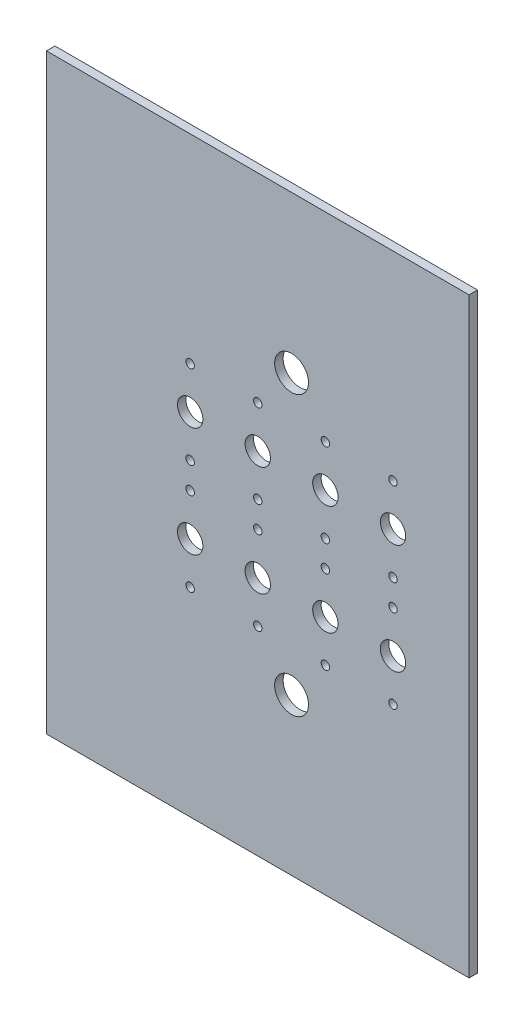
ISO-10303-21;
HEADER;
FILE_DESCRIPTION(('STEP AP214'),'2;1');
FILE_NAME('part.step','',(''),(''),'','','');
FILE_SCHEMA(('AUTOMOTIVE_DESIGN { 1 0 10303 214 1 1 1 1 }'));
ENDSEC;
DATA;
#1=APPLICATION_CONTEXT('core data for automotive mechanical design processes');
#2=APPLICATION_PROTOCOL_DEFINITION('international standard','automotive_design',2000,#1);
#3=PRODUCT_CONTEXT('',#1,'mechanical');
#4=PRODUCT('Part','Part','',(#3));
#5=PRODUCT_RELATED_PRODUCT_CATEGORY('part','',(#4));
#6=PRODUCT_DEFINITION_FORMATION('','',#4);
#7=PRODUCT_DEFINITION_CONTEXT('part definition',#1,'design');
#8=PRODUCT_DEFINITION('design','',#6,#7);
#9=PRODUCT_DEFINITION_SHAPE('','',#8);
#10=(LENGTH_UNIT() NAMED_UNIT(*) SI_UNIT(.MILLI.,.METRE.));
#11=(NAMED_UNIT(*) PLANE_ANGLE_UNIT() SI_UNIT($,.RADIAN.));
#12=(NAMED_UNIT(*) SI_UNIT($,.STERADIAN.) SOLID_ANGLE_UNIT());
#13=UNCERTAINTY_MEASURE_WITH_UNIT(LENGTH_MEASURE(1.E-05),#10,'distance_accuracy_value','');
#14=(GEOMETRIC_REPRESENTATION_CONTEXT(3) GLOBAL_UNCERTAINTY_ASSIGNED_CONTEXT((#13)) GLOBAL_UNIT_ASSIGNED_CONTEXT((#10,
#11,#12)) REPRESENTATION_CONTEXT('',''));
#15=CARTESIAN_POINT('',(0.,0.,0.));
#16=DIRECTION('',(0.,0.,1.));
#17=DIRECTION('',(1.,0.,0.));
#18=AXIS2_PLACEMENT_3D('',#15,#16,#17);
#19=CARTESIAN_POINT('',(0.,0.,10.));
#20=DIRECTION('',(0.,0.,-1.00000000000002));
#21=DIRECTION('',(-1.,0.,0.));
#22=AXIS2_PLACEMENT_3D('',#19,#20,#21);
#23=PLANE('',#22);
#24=CARTESIAN_POINT('',(330.,-65.000000000001,9.99999999999796));
#25=DIRECTION('',(0.,0.,1.00000000000002));
#26=DIRECTION('',(1.,0.,0.));
#27=AXIS2_PLACEMENT_3D('',#24,#25,#26);
#28=CIRCLE('',#27,14.9999999999997);
#29=CARTESIAN_POINT('',(345.,-65.000000000001,9.99999999999791));
#30=VERTEX_POINT('',#29);
#31=EDGE_CURVE('E260',#30,#30,#28,.T.);
#32=ORIENTED_EDGE('',*,*,#31,.F.);
#33=EDGE_LOOP('',(#32));
#34=FACE_BOUND('',#33,.T.);
#35=CARTESIAN_POINT('',(169.999999999999,-65.000000000001,9.99999999999796));
#36=DIRECTION('',(0.,0.,1.00000000000002));
#37=DIRECTION('',(1.,0.,0.));
#38=AXIS2_PLACEMENT_3D('',#35,#36,#37);
#39=CIRCLE('',#38,15.0000000000001);
#40=CARTESIAN_POINT('',(185.,-65.000000000001,9.99999999999791));
#41=VERTEX_POINT('',#40);
#42=EDGE_CURVE('E243',#41,#41,#39,.T.);
#43=ORIENTED_EDGE('',*,*,#42,.F.);
#44=EDGE_LOOP('',(#43));
#45=FACE_BOUND('',#44,.T.);
#46=CARTESIAN_POINT('',(410.,-114.500000000002,9.99999999999796));
#47=DIRECTION('',(0.,0.,1.00000000000002));
#48=DIRECTION('',(1.,0.,0.));
#49=AXIS2_PLACEMENT_3D('',#46,#47,#48);
#50=CIRCLE('',#49,4.99999999999901);
#51=CARTESIAN_POINT('',(414.999999999999,-114.500000000002,9.99999999999794));
#52=VERTEX_POINT('',#51);
#53=EDGE_CURVE('E231',#52,#52,#50,.T.);
#54=ORIENTED_EDGE('',*,*,#53,.F.);
#55=EDGE_LOOP('',(#54));
#56=FACE_BOUND('',#55,.T.);
#57=CARTESIAN_POINT('',(330.,-114.500000000002,9.99999999999796));
#58=DIRECTION('',(0.,0.,1.00000000000002));
#59=DIRECTION('',(1.,0.,0.));
#60=AXIS2_PLACEMENT_3D('',#57,#58,#59);
#61=CIRCLE('',#60,4.99999999999901);
#62=CARTESIAN_POINT('',(334.999999999999,-114.500000000002,9.99999999999794));
#63=VERTEX_POINT('',#62);
#64=EDGE_CURVE('E222',#63,#63,#61,.T.);
#65=ORIENTED_EDGE('',*,*,#64,.F.);
#66=EDGE_LOOP('',(#65));
#67=FACE_BOUND('',#66,.T.);
#68=CARTESIAN_POINT('',(250.,-114.500000000002,9.99999999999796));
#69=DIRECTION('',(0.,0.,1.00000000000002));
#70=DIRECTION('',(1.,0.,0.));
#71=AXIS2_PLACEMENT_3D('',#68,#69,#70);
#72=CIRCLE('',#71,4.99999999999989);
#73=CARTESIAN_POINT('',(254.999999999999,-114.500000000002,9.99999999999794));
#74=VERTEX_POINT('',#73);
#75=EDGE_CURVE('E207',#74,#74,#72,.T.);
#76=ORIENTED_EDGE('',*,*,#75,.F.);
#77=EDGE_LOOP('',(#76));
#78=FACE_BOUND('',#77,.T.);
#79=CARTESIAN_POINT('',(169.999999999999,-114.500000000002,9.99999999999796));
#80=DIRECTION('',(0.,0.,1.00000000000002));
#81=DIRECTION('',(1.,0.,0.));
#82=AXIS2_PLACEMENT_3D('',#79,#80,#81);
#83=CIRCLE('',#82,4.99999999999989);
#84=CARTESIAN_POINT('',(174.999999999999,-114.500000000002,9.99999999999794));
#85=VERTEX_POINT('',#84);
#86=EDGE_CURVE('E197',#85,#85,#83,.T.);
#87=ORIENTED_EDGE('',*,*,#86,.F.);
#88=EDGE_LOOP('',(#87));
#89=FACE_BOUND('',#88,.T.);
#90=CARTESIAN_POINT('',(330.,65.0000000000014,9.99999999999796));
#91=DIRECTION('',(0.,0.,1.00000000000002));
#92=DIRECTION('',(1.,0.,0.));
#93=AXIS2_PLACEMENT_3D('',#90,#91,#92);
#94=CIRCLE('',#93,14.9999999999997);
#95=CARTESIAN_POINT('',(345.,65.0000000000014,9.99999999999791));
#96=VERTEX_POINT('',#95);
#97=EDGE_CURVE('E183',#96,#96,#94,.T.);
#98=ORIENTED_EDGE('',*,*,#97,.F.);
#99=EDGE_LOOP('',(#98));
#100=FACE_BOUND('',#99,.T.);
#101=CARTESIAN_POINT('',(169.999999999999,65.0000000000014,9.99999999999796));
#102=DIRECTION('',(0.,0.,1.00000000000002));
#103=DIRECTION('',(1.,0.,0.));
#104=AXIS2_PLACEMENT_3D('',#101,#102,#103);
#105=CIRCLE('',#104,15.0000000000001);
#106=CARTESIAN_POINT('',(185.,65.0000000000014,9.99999999999791));
#107=VERTEX_POINT('',#106);
#108=EDGE_CURVE('E174',#107,#107,#105,.T.);
#109=ORIENTED_EDGE('',*,*,#108,.F.);
#110=EDGE_LOOP('',(#109));
#111=FACE_BOUND('',#110,.T.);
#112=CARTESIAN_POINT('',(290.,165.000000000002,9.99999999999796));
#113=DIRECTION('',(0.,0.,1.00000000000002));
#114=DIRECTION('',(1.,0.,0.));
#115=AXIS2_PLACEMENT_3D('',#112,#113,#114);
#116=CIRCLE('',#115,20.);
#117=CARTESIAN_POINT('',(310.,165.000000000002,9.99999999999789));
#118=VERTEX_POINT('',#117);
#119=EDGE_CURVE('E161',#118,#118,#116,.T.);
#120=ORIENTED_EDGE('',*,*,#119,.F.);
#121=EDGE_LOOP('',(#120));
#122=FACE_BOUND('',#121,.T.);
#123=CARTESIAN_POINT('',(410.,114.500000000003,9.99999999999796));
#124=DIRECTION('',(0.,0.,1.00000000000002));
#125=DIRECTION('',(1.,0.,0.));
#126=AXIS2_PLACEMENT_3D('',#123,#124,#125);
#127=CIRCLE('',#126,4.99999999999901);
#128=CARTESIAN_POINT('',(414.999999999999,114.500000000003,9.99999999999794));
#129=VERTEX_POINT('',#128);
#130=EDGE_CURVE('E149',#129,#129,#127,.T.);
#131=ORIENTED_EDGE('',*,*,#130,.F.);
#132=EDGE_LOOP('',(#131));
#133=FACE_BOUND('',#132,.T.);
#134=CARTESIAN_POINT('',(330.,114.500000000003,9.99999999999796));
#135=DIRECTION('',(0.,0.,1.00000000000002));
#136=DIRECTION('',(1.,0.,0.));
#137=AXIS2_PLACEMENT_3D('',#134,#135,#136);
#138=CIRCLE('',#137,4.99999999999901);
#139=CARTESIAN_POINT('',(334.999999999999,114.500000000003,9.99999999999794));
#140=VERTEX_POINT('',#139);
#141=EDGE_CURVE('E140',#140,#140,#138,.T.);
#142=ORIENTED_EDGE('',*,*,#141,.F.);
#143=EDGE_LOOP('',(#142));
#144=FACE_BOUND('',#143,.T.);
#145=CARTESIAN_POINT('',(250.,114.500000000003,9.99999999999796));
#146=DIRECTION('',(0.,0.,1.00000000000002));
#147=DIRECTION('',(1.,0.,0.));
#148=AXIS2_PLACEMENT_3D('',#145,#146,#147);
#149=CIRCLE('',#148,4.99999999999989);
#150=CARTESIAN_POINT('',(254.999999999999,114.500000000003,9.99999999999794));
#151=VERTEX_POINT('',#150);
#152=EDGE_CURVE('E124',#151,#151,#149,.T.);
#153=ORIENTED_EDGE('',*,*,#152,.F.);
#154=EDGE_LOOP('',(#153));
#155=FACE_BOUND('',#154,.T.);
#156=CARTESIAN_POINT('',(169.999999999999,114.500000000003,9.99999999999796));
#157=DIRECTION('',(0.,0.,1.00000000000002));
#158=DIRECTION('',(1.,0.,0.));
#159=AXIS2_PLACEMENT_3D('',#156,#157,#158);
#160=CIRCLE('',#159,4.99999999999989);
#161=CARTESIAN_POINT('',(174.999999999999,114.500000000003,9.99999999999794));
#162=VERTEX_POINT('',#161);
#163=EDGE_CURVE('E102',#162,#162,#160,.T.);
#164=ORIENTED_EDGE('',*,*,#163,.F.);
#165=EDGE_LOOP('',(#164));
#166=FACE_BOUND('',#165,.T.);
#167=DIRECTION('',(0.,-1.00000000000002,0.));
#168=VECTOR('',#167,1.);
#169=CARTESIAN_POINT('',(0.,-350.000000000004,10.));
#170=LINE('',#169,#168);
#171=CARTESIAN_POINT('',(0.,350.000000000004,10.));
#172=VERTEX_POINT('',#171);
#173=CARTESIAN_POINT('',(0.,-350.000000000004,10.));
#174=VERTEX_POINT('',#173);
#175=EDGE_CURVE('E90',#172,#174,#170,.T.);
#176=ORIENTED_EDGE('',*,*,#175,.T.);
#177=DIRECTION('',(1.,0.,0.));
#178=VECTOR('',#177,1.);
#179=CARTESIAN_POINT('',(500.,-350.000000000004,9.9999999999979));
#180=LINE('',#179,#178);
#181=CARTESIAN_POINT('',(500.,-350.000000000004,9.9999999999979));
#182=VERTEX_POINT('',#181);
#183=EDGE_CURVE('E82',#174,#182,#180,.T.);
#184=ORIENTED_EDGE('',*,*,#183,.T.);
#185=DIRECTION('',(0.,1.00000000000002,0.));
#186=VECTOR('',#185,1.);
#187=CARTESIAN_POINT('',(500.,350.000000000004,9.9999999999979));
#188=LINE('',#187,#186);
#189=CARTESIAN_POINT('',(500.,350.000000000004,9.9999999999979));
#190=VERTEX_POINT('',#189);
#191=EDGE_CURVE('E87',#182,#190,#188,.T.);
#192=ORIENTED_EDGE('',*,*,#191,.T.);
#193=DIRECTION('',(-1.,0.,0.));
#194=VECTOR('',#193,1.);
#195=CARTESIAN_POINT('',(0.,350.000000000004,10.));
#196=LINE('',#195,#194);
#197=EDGE_CURVE('E53',#190,#172,#196,.T.);
#198=ORIENTED_EDGE('',*,*,#197,.T.);
#199=EDGE_LOOP('',(#176,#184,#192,#198));
#200=FACE_BOUND('',#199,.T.);
#201=CARTESIAN_POINT('',(169.999999999999,15.5000000000001,9.99999999999796));
#202=DIRECTION('',(0.,0.,1.00000000000002));
#203=DIRECTION('',(1.,0.,0.));
#204=AXIS2_PLACEMENT_3D('',#201,#202,#203);
#205=CIRCLE('',#204,4.99999999999989);
#206=CARTESIAN_POINT('',(174.999999999999,15.5000000000001,9.99999999999794));
#207=VERTEX_POINT('',#206);
#208=EDGE_CURVE('E116',#207,#207,#205,.T.);
#209=ORIENTED_EDGE('',*,*,#208,.F.);
#210=EDGE_LOOP('',(#209));
#211=FACE_BOUND('',#210,.T.);
#212=CARTESIAN_POINT('',(250.,15.5000000000001,9.99999999999796));
#213=DIRECTION('',(0.,0.,1.00000000000002));
#214=DIRECTION('',(1.,0.,0.));
#215=AXIS2_PLACEMENT_3D('',#212,#213,#214);
#216=CIRCLE('',#215,4.99999999999989);
#217=CARTESIAN_POINT('',(254.999999999999,15.5000000000001,9.99999999999794));
#218=VERTEX_POINT('',#217);
#219=EDGE_CURVE('E132',#218,#218,#216,.T.);
#220=ORIENTED_EDGE('',*,*,#219,.F.);
#221=EDGE_LOOP('',(#220));
#222=FACE_BOUND('',#221,.T.);
#223=CARTESIAN_POINT('',(330.,15.5000000000001,9.99999999999796));
#224=DIRECTION('',(0.,0.,1.00000000000002));
#225=DIRECTION('',(1.,0.,0.));
#226=AXIS2_PLACEMENT_3D('',#223,#224,#225);
#227=CIRCLE('',#226,4.99999999999901);
#228=CARTESIAN_POINT('',(334.999999999999,15.5000000000001,9.99999999999794));
#229=VERTEX_POINT('',#228);
#230=EDGE_CURVE('E141',#229,#229,#227,.T.);
#231=ORIENTED_EDGE('',*,*,#230,.F.);
#232=EDGE_LOOP('',(#231));
#233=FACE_BOUND('',#232,.T.);
#234=CARTESIAN_POINT('',(410.,15.5000000000001,9.99999999999796));
#235=DIRECTION('',(0.,0.,1.00000000000002));
#236=DIRECTION('',(1.,0.,0.));
#237=AXIS2_PLACEMENT_3D('',#234,#235,#236);
#238=CIRCLE('',#237,4.99999999999901);
#239=CARTESIAN_POINT('',(414.999999999999,15.5000000000001,9.99999999999794));
#240=VERTEX_POINT('',#239);
#241=EDGE_CURVE('E154',#240,#240,#238,.T.);
#242=ORIENTED_EDGE('',*,*,#241,.F.);
#243=EDGE_LOOP('',(#242));
#244=FACE_BOUND('',#243,.T.);
#245=CARTESIAN_POINT('',(290.,-165.000000000002,9.99999999999796));
#246=DIRECTION('',(0.,0.,1.00000000000002));
#247=DIRECTION('',(1.,0.,0.));
#248=AXIS2_PLACEMENT_3D('',#245,#246,#247);
#249=CIRCLE('',#248,20.);
#250=CARTESIAN_POINT('',(310.,-165.000000000002,9.99999999999789));
#251=VERTEX_POINT('',#250);
#252=EDGE_CURVE('E170',#251,#251,#249,.T.);
#253=ORIENTED_EDGE('',*,*,#252,.F.);
#254=EDGE_LOOP('',(#253));
#255=FACE_BOUND('',#254,.T.);
#256=CARTESIAN_POINT('',(250.,65.0000000000014,9.99999999999796));
#257=DIRECTION('',(0.,0.,1.00000000000002));
#258=DIRECTION('',(1.,0.,0.));
#259=AXIS2_PLACEMENT_3D('',#256,#257,#258);
#260=CIRCLE('',#259,15.0000000000001);
#261=CARTESIAN_POINT('',(265.,65.0000000000014,9.99999999999791));
#262=VERTEX_POINT('',#261);
#263=EDGE_CURVE('E177',#262,#262,#260,.T.);
#264=ORIENTED_EDGE('',*,*,#263,.F.);
#265=EDGE_LOOP('',(#264));
#266=FACE_BOUND('',#265,.T.);
#267=CARTESIAN_POINT('',(410.,65.0000000000014,9.99999999999796));
#268=DIRECTION('',(0.,0.,1.00000000000002));
#269=DIRECTION('',(1.,0.,0.));
#270=AXIS2_PLACEMENT_3D('',#267,#268,#269);
#271=CIRCLE('',#270,14.9999999999997);
#272=CARTESIAN_POINT('',(425.,65.0000000000014,9.99999999999791));
#273=VERTEX_POINT('',#272);
#274=EDGE_CURVE('E193',#273,#273,#271,.T.);
#275=ORIENTED_EDGE('',*,*,#274,.F.);
#276=EDGE_LOOP('',(#275));
#277=FACE_BOUND('',#276,.T.);
#278=CARTESIAN_POINT('',(169.999999999999,-15.5000000000001,9.99999999999796));
#279=DIRECTION('',(0.,0.,1.00000000000002));
#280=DIRECTION('',(1.,0.,0.));
#281=AXIS2_PLACEMENT_3D('',#278,#279,#280);
#282=CIRCLE('',#281,4.99999999999989);
#283=CARTESIAN_POINT('',(174.999999999999,-15.5000000000001,9.99999999999794));
#284=VERTEX_POINT('',#283);
#285=EDGE_CURVE('E201',#284,#284,#282,.T.);
#286=ORIENTED_EDGE('',*,*,#285,.F.);
#287=EDGE_LOOP('',(#286));
#288=FACE_BOUND('',#287,.T.);
#289=CARTESIAN_POINT('',(250.,-15.5000000000001,9.99999999999796));
#290=DIRECTION('',(0.,0.,1.00000000000002));
#291=DIRECTION('',(1.,0.,0.));
#292=AXIS2_PLACEMENT_3D('',#289,#290,#291);
#293=CIRCLE('',#292,4.99999999999989);
#294=CARTESIAN_POINT('',(254.999999999999,-15.5000000000001,9.99999999999794));
#295=VERTEX_POINT('',#294);
#296=EDGE_CURVE('E214',#295,#295,#293,.T.);
#297=ORIENTED_EDGE('',*,*,#296,.F.);
#298=EDGE_LOOP('',(#297));
#299=FACE_BOUND('',#298,.T.);
#300=CARTESIAN_POINT('',(330.,-15.5000000000001,9.99999999999796));
#301=DIRECTION('',(0.,0.,1.00000000000002));
#302=DIRECTION('',(1.,0.,0.));
#303=AXIS2_PLACEMENT_3D('',#300,#301,#302);
#304=CIRCLE('',#303,4.99999999999901);
#305=CARTESIAN_POINT('',(334.999999999999,-15.5000000000001,9.99999999999794));
#306=VERTEX_POINT('',#305);
#307=EDGE_CURVE('E230',#306,#306,#304,.T.);
#308=ORIENTED_EDGE('',*,*,#307,.F.);
#309=EDGE_LOOP('',(#308));
#310=FACE_BOUND('',#309,.T.);
#311=CARTESIAN_POINT('',(410.,-15.5000000000001,9.99999999999796));
#312=DIRECTION('',(0.,0.,1.00000000000002));
#313=DIRECTION('',(1.,0.,0.));
#314=AXIS2_PLACEMENT_3D('',#311,#312,#313);
#315=CIRCLE('',#314,4.99999999999901);
#316=CARTESIAN_POINT('',(414.999999999999,-15.5000000000001,9.99999999999794));
#317=VERTEX_POINT('',#316);
#318=EDGE_CURVE('E239',#317,#317,#315,.T.);
#319=ORIENTED_EDGE('',*,*,#318,.F.);
#320=EDGE_LOOP('',(#319));
#321=FACE_BOUND('',#320,.T.);
#322=CARTESIAN_POINT('',(250.,-65.000000000001,9.99999999999796));
#323=DIRECTION('',(0.,0.,1.00000000000002));
#324=DIRECTION('',(1.,0.,0.));
#325=AXIS2_PLACEMENT_3D('',#322,#323,#324);
#326=CIRCLE('',#325,15.0000000000001);
#327=CARTESIAN_POINT('',(265.,-65.000000000001,9.99999999999791));
#328=VERTEX_POINT('',#327);
#329=EDGE_CURVE('E253',#328,#328,#326,.T.);
#330=ORIENTED_EDGE('',*,*,#329,.F.);
#331=EDGE_LOOP('',(#330));
#332=FACE_BOUND('',#331,.T.);
#333=CARTESIAN_POINT('',(410.,-65.000000000001,9.99999999999796));
#334=DIRECTION('',(0.,0.,1.00000000000002));
#335=DIRECTION('',(1.,0.,0.));
#336=AXIS2_PLACEMENT_3D('',#333,#334,#335);
#337=CIRCLE('',#336,14.9999999999997);
#338=CARTESIAN_POINT('',(425.,-65.000000000001,9.99999999999791));
#339=VERTEX_POINT('',#338);
#340=EDGE_CURVE('E263',#339,#339,#337,.T.);
#341=ORIENTED_EDGE('',*,*,#340,.F.);
#342=EDGE_LOOP('',(#341));
#343=FACE_BOUND('',#342,.T.);
#344=ADVANCED_FACE('F40',(#34,#45,#56,#67,#78,#89,#100,#111,#122,#133,#144,#155,#166,#200,#211,
#222,#233,#244,#255,#266,#277,#288,#299,#310,#321,#332,#343),#23,.F.);
#345=CARTESIAN_POINT('',(0.,0.,0.));
#346=DIRECTION('',(0.,0.,-1.00000000000002));
#347=DIRECTION('',(-1.,0.,0.));
#348=AXIS2_PLACEMENT_3D('',#345,#346,#347);
#349=PLANE('',#348);
#350=CARTESIAN_POINT('',(330.,-65.000000000001,-2.05391259555654E-12));
#351=DIRECTION('',(0.,0.,1.00000000000002));
#352=DIRECTION('',(1.,0.,0.));
#353=AXIS2_PLACEMENT_3D('',#350,#351,#352);
#354=CIRCLE('',#353,14.9999999999997);
#355=CARTESIAN_POINT('',(345.,-65.000000000001,-2.10225690468453E-12));
#356=VERTEX_POINT('',#355);
#357=EDGE_CURVE('E257',#356,#356,#354,.T.);
#358=ORIENTED_EDGE('',*,*,#357,.T.);
#359=EDGE_LOOP('',(#358));
#360=FACE_BOUND('',#359,.T.);
#361=CARTESIAN_POINT('',(169.999999999999,-65.000000000001,-2.05391259555654E-12));
#362=DIRECTION('',(0.,0.,1.00000000000002));
#363=DIRECTION('',(1.,0.,0.));
#364=AXIS2_PLACEMENT_3D('',#361,#362,#363);
#365=CIRCLE('',#364,15.0000000000001);
#366=CARTESIAN_POINT('',(185.,-65.000000000001,-2.10225690468453E-12));
#367=VERTEX_POINT('',#366);
#368=EDGE_CURVE('E246',#367,#367,#365,.T.);
#369=ORIENTED_EDGE('',*,*,#368,.T.);
#370=EDGE_LOOP('',(#369));
#371=FACE_BOUND('',#370,.T.);
#372=CARTESIAN_POINT('',(410.,-114.500000000002,-2.05391259555654E-12));
#373=DIRECTION('',(0.,0.,1.00000000000002));
#374=DIRECTION('',(1.,0.,0.));
#375=AXIS2_PLACEMENT_3D('',#372,#373,#374);
#376=CIRCLE('',#375,4.99999999999901);
#377=CARTESIAN_POINT('',(414.999999999999,-114.500000000002,-2.07002736526587E-12));
#378=VERTEX_POINT('',#377);
#379=EDGE_CURVE('E237',#378,#378,#376,.T.);
#380=ORIENTED_EDGE('',*,*,#379,.T.);
#381=EDGE_LOOP('',(#380));
#382=FACE_BOUND('',#381,.T.);
#383=CARTESIAN_POINT('',(330.,-114.500000000002,-2.05391259555654E-12));
#384=DIRECTION('',(0.,0.,1.00000000000002));
#385=DIRECTION('',(1.,0.,0.));
#386=AXIS2_PLACEMENT_3D('',#383,#384,#385);
#387=CIRCLE('',#386,4.99999999999901);
#388=CARTESIAN_POINT('',(334.999999999999,-114.500000000002,-2.07002736526587E-12));
#389=VERTEX_POINT('',#388);
#390=EDGE_CURVE('E221',#389,#389,#387,.T.);
#391=ORIENTED_EDGE('',*,*,#390,.T.);
#392=EDGE_LOOP('',(#391));
#393=FACE_BOUND('',#392,.T.);
#394=CARTESIAN_POINT('',(250.,-114.500000000002,-2.05391259555654E-12));
#395=DIRECTION('',(0.,0.,1.00000000000002));
#396=DIRECTION('',(1.,0.,0.));
#397=AXIS2_PLACEMENT_3D('',#394,#395,#396);
#398=CIRCLE('',#397,4.99999999999989);
#399=CARTESIAN_POINT('',(254.999999999999,-114.500000000002,-2.07002736526587E-12));
#400=VERTEX_POINT('',#399);
#401=EDGE_CURVE('E215',#400,#400,#398,.T.);
#402=ORIENTED_EDGE('',*,*,#401,.T.);
#403=EDGE_LOOP('',(#402));
#404=FACE_BOUND('',#403,.T.);
#405=CARTESIAN_POINT('',(169.999999999999,-114.500000000002,-2.05391259555654E-12));
#406=DIRECTION('',(0.,0.,1.00000000000002));
#407=DIRECTION('',(1.,0.,0.));
#408=AXIS2_PLACEMENT_3D('',#405,#406,#407);
#409=CIRCLE('',#408,4.99999999999989);
#410=CARTESIAN_POINT('',(174.999999999999,-114.500000000002,-2.07002736526587E-12));
#411=VERTEX_POINT('',#410);
#412=EDGE_CURVE('E199',#411,#411,#409,.T.);
#413=ORIENTED_EDGE('',*,*,#412,.T.);
#414=EDGE_LOOP('',(#413));
#415=FACE_BOUND('',#414,.T.);
#416=CARTESIAN_POINT('',(330.,65.0000000000014,-2.05391259555654E-12));
#417=DIRECTION('',(0.,0.,1.00000000000002));
#418=DIRECTION('',(1.,0.,0.));
#419=AXIS2_PLACEMENT_3D('',#416,#417,#418);
#420=CIRCLE('',#419,14.9999999999997);
#421=CARTESIAN_POINT('',(345.,65.0000000000014,-2.10225690468453E-12));
#422=VERTEX_POINT('',#421);
#423=EDGE_CURVE('E189',#422,#422,#420,.T.);
#424=ORIENTED_EDGE('',*,*,#423,.T.);
#425=EDGE_LOOP('',(#424));
#426=FACE_BOUND('',#425,.T.);
#427=CARTESIAN_POINT('',(169.999999999999,65.0000000000014,-2.05391259555654E-12));
#428=DIRECTION('',(0.,0.,1.00000000000002));
#429=DIRECTION('',(1.,0.,0.));
#430=AXIS2_PLACEMENT_3D('',#427,#428,#429);
#431=CIRCLE('',#430,15.0000000000001);
#432=CARTESIAN_POINT('',(185.,65.0000000000014,-2.10225690468453E-12));
#433=VERTEX_POINT('',#432);
#434=EDGE_CURVE('E178',#433,#433,#431,.T.);
#435=ORIENTED_EDGE('',*,*,#434,.T.);
#436=EDGE_LOOP('',(#435));
#437=FACE_BOUND('',#436,.T.);
#438=CARTESIAN_POINT('',(290.,165.000000000002,-2.05391259555654E-12));
#439=DIRECTION('',(0.,0.,1.00000000000002));
#440=DIRECTION('',(1.,0.,0.));
#441=AXIS2_PLACEMENT_3D('',#438,#439,#440);
#442=CIRCLE('',#441,20.);
#443=CARTESIAN_POINT('',(310.,165.000000000002,-2.11837167439386E-12));
#444=VERTEX_POINT('',#443);
#445=EDGE_CURVE('E163',#444,#444,#442,.T.);
#446=ORIENTED_EDGE('',*,*,#445,.T.);
#447=EDGE_LOOP('',(#446));
#448=FACE_BOUND('',#447,.T.);
#449=CARTESIAN_POINT('',(410.,114.500000000003,-2.05391259555654E-12));
#450=DIRECTION('',(0.,0.,1.00000000000002));
#451=DIRECTION('',(1.,0.,0.));
#452=AXIS2_PLACEMENT_3D('',#449,#450,#451);
#453=CIRCLE('',#452,4.99999999999901);
#454=CARTESIAN_POINT('',(414.999999999999,114.500000000003,-2.07002736526587E-12));
#455=VERTEX_POINT('',#454);
#456=EDGE_CURVE('E155',#455,#455,#453,.T.);
#457=ORIENTED_EDGE('',*,*,#456,.T.);
#458=EDGE_LOOP('',(#457));
#459=FACE_BOUND('',#458,.T.);
#460=CARTESIAN_POINT('',(330.,114.500000000003,-2.05391259555654E-12));
#461=DIRECTION('',(0.,0.,1.00000000000002));
#462=DIRECTION('',(1.,0.,0.));
#463=AXIS2_PLACEMENT_3D('',#460,#461,#462);
#464=CIRCLE('',#463,4.99999999999901);
#465=CARTESIAN_POINT('',(334.999999999999,114.500000000003,-2.07002736526587E-12));
#466=VERTEX_POINT('',#465);
#467=EDGE_CURVE('E139',#466,#466,#464,.T.);
#468=ORIENTED_EDGE('',*,*,#467,.T.);
#469=EDGE_LOOP('',(#468));
#470=FACE_BOUND('',#469,.T.);
#471=CARTESIAN_POINT('',(250.,114.500000000003,-2.05391259555654E-12));
#472=DIRECTION('',(0.,0.,1.00000000000002));
#473=DIRECTION('',(1.,0.,0.));
#474=AXIS2_PLACEMENT_3D('',#471,#472,#473);
#475=CIRCLE('',#474,4.99999999999989);
#476=CARTESIAN_POINT('',(254.999999999999,114.500000000003,-2.07002736526587E-12));
#477=VERTEX_POINT('',#476);
#478=EDGE_CURVE('E126',#477,#477,#475,.T.);
#479=ORIENTED_EDGE('',*,*,#478,.T.);
#480=EDGE_LOOP('',(#479));
#481=FACE_BOUND('',#480,.T.);
#482=CARTESIAN_POINT('',(169.999999999999,114.500000000003,-2.05391259555654E-12));
#483=DIRECTION('',(0.,0.,1.00000000000002));
#484=DIRECTION('',(1.,0.,0.));
#485=AXIS2_PLACEMENT_3D('',#482,#483,#484);
#486=CIRCLE('',#485,4.99999999999989);
#487=CARTESIAN_POINT('',(174.999999999999,114.500000000003,-2.07002736526587E-12));
#488=VERTEX_POINT('',#487);
#489=EDGE_CURVE('E117',#488,#488,#486,.T.);
#490=ORIENTED_EDGE('',*,*,#489,.T.);
#491=EDGE_LOOP('',(#490));
#492=FACE_BOUND('',#491,.T.);
#493=DIRECTION('',(0.,-1.00000000000002,0.));
#494=VECTOR('',#493,1.);
#495=CARTESIAN_POINT('',(0.,-350.000000000004,0.));
#496=LINE('',#495,#494);
#497=CARTESIAN_POINT('',(0.,350.000000000004,0.));
#498=VERTEX_POINT('',#497);
#499=CARTESIAN_POINT('',(0.,-350.000000000004,0.));
#500=VERTEX_POINT('',#499);
#501=EDGE_CURVE('E101',#498,#500,#496,.T.);
#502=ORIENTED_EDGE('',*,*,#501,.F.);
#503=DIRECTION('',(-1.,0.,0.));
#504=VECTOR('',#503,1.);
#505=CARTESIAN_POINT('',(0.,350.000000000004,0.));
#506=LINE('',#505,#504);
#507=CARTESIAN_POINT('',(500.,350.000000000004,-2.05391259555654E-12));
#508=VERTEX_POINT('',#507);
#509=EDGE_CURVE('E80',#508,#498,#506,.T.);
#510=ORIENTED_EDGE('',*,*,#509,.F.);
#511=DIRECTION('',(0.,1.00000000000002,0.));
#512=VECTOR('',#511,1.);
#513=CARTESIAN_POINT('',(500.,350.000000000004,-2.05391259555654E-12));
#514=LINE('',#513,#512);
#515=CARTESIAN_POINT('',(500.,-350.000000000004,-2.05391259555654E-12));
#516=VERTEX_POINT('',#515);
#517=EDGE_CURVE('E72',#516,#508,#514,.T.);
#518=ORIENTED_EDGE('',*,*,#517,.F.);
#519=DIRECTION('',(1.,0.,0.));
#520=VECTOR('',#519,1.);
#521=CARTESIAN_POINT('',(500.,-350.000000000004,-2.05391259555654E-12));
#522=LINE('',#521,#520);
#523=EDGE_CURVE('E91',#500,#516,#522,.T.);
#524=ORIENTED_EDGE('',*,*,#523,.F.);
#525=EDGE_LOOP('',(#502,#510,#518,#524));
#526=FACE_BOUND('',#525,.T.);
#527=CARTESIAN_POINT('',(169.999999999999,15.5000000000001,-2.05391259555654E-12));
#528=DIRECTION('',(0.,0.,1.00000000000002));
#529=DIRECTION('',(1.,0.,0.));
#530=AXIS2_PLACEMENT_3D('',#527,#528,#529);
#531=CIRCLE('',#530,4.99999999999989);
#532=CARTESIAN_POINT('',(174.999999999999,15.5000000000001,-2.07002736526587E-12));
#533=VERTEX_POINT('',#532);
#534=EDGE_CURVE('E125',#533,#533,#531,.T.);
#535=ORIENTED_EDGE('',*,*,#534,.T.);
#536=EDGE_LOOP('',(#535));
#537=FACE_BOUND('',#536,.T.);
#538=CARTESIAN_POINT('',(250.,15.5000000000001,-2.05391259555654E-12));
#539=DIRECTION('',(0.,0.,1.00000000000002));
#540=DIRECTION('',(1.,0.,0.));
#541=AXIS2_PLACEMENT_3D('',#538,#539,#540);
#542=CIRCLE('',#541,4.99999999999989);
#543=CARTESIAN_POINT('',(254.999999999999,15.5000000000001,-2.07002736526587E-12));
#544=VERTEX_POINT('',#543);
#545=EDGE_CURVE('E131',#544,#544,#542,.T.);
#546=ORIENTED_EDGE('',*,*,#545,.T.);
#547=EDGE_LOOP('',(#546));
#548=FACE_BOUND('',#547,.T.);
#549=CARTESIAN_POINT('',(330.,15.5000000000001,-2.05391259555654E-12));
#550=DIRECTION('',(0.,0.,1.00000000000002));
#551=DIRECTION('',(1.,0.,0.));
#552=AXIS2_PLACEMENT_3D('',#549,#550,#551);
#553=CIRCLE('',#552,4.99999999999901);
#554=CARTESIAN_POINT('',(334.999999999999,15.5000000000001,-2.07002736526587E-12));
#555=VERTEX_POINT('',#554);
#556=EDGE_CURVE('E148',#555,#555,#553,.T.);
#557=ORIENTED_EDGE('',*,*,#556,.T.);
#558=EDGE_LOOP('',(#557));
#559=FACE_BOUND('',#558,.T.);
#560=CARTESIAN_POINT('',(410.,15.5000000000001,-2.05391259555654E-12));
#561=DIRECTION('',(0.,0.,1.00000000000002));
#562=DIRECTION('',(1.,0.,0.));
#563=AXIS2_PLACEMENT_3D('',#560,#561,#562);
#564=CIRCLE('',#563,4.99999999999901);
#565=CARTESIAN_POINT('',(414.999999999999,15.5000000000001,-2.07002736526587E-12));
#566=VERTEX_POINT('',#565);
#567=EDGE_CURVE('E158',#566,#566,#564,.T.);
#568=ORIENTED_EDGE('',*,*,#567,.T.);
#569=EDGE_LOOP('',(#568));
#570=FACE_BOUND('',#569,.T.);
#571=CARTESIAN_POINT('',(290.,-165.000000000002,-2.05391259555654E-12));
#572=DIRECTION('',(0.,0.,1.00000000000002));
#573=DIRECTION('',(1.,0.,0.));
#574=AXIS2_PLACEMENT_3D('',#571,#572,#573);
#575=CIRCLE('',#574,20.);
#576=CARTESIAN_POINT('',(310.,-165.000000000002,-2.11837167439386E-12));
#577=VERTEX_POINT('',#576);
#578=EDGE_CURVE('E168',#577,#577,#575,.T.);
#579=ORIENTED_EDGE('',*,*,#578,.T.);
#580=EDGE_LOOP('',(#579));
#581=FACE_BOUND('',#580,.T.);
#582=CARTESIAN_POINT('',(250.,65.0000000000014,-2.05391259555654E-12));
#583=DIRECTION('',(0.,0.,1.00000000000002));
#584=DIRECTION('',(1.,0.,0.));
#585=AXIS2_PLACEMENT_3D('',#582,#583,#584);
#586=CIRCLE('',#585,15.0000000000001);
#587=CARTESIAN_POINT('',(265.,65.0000000000014,-2.10225690468453E-12));
#588=VERTEX_POINT('',#587);
#589=EDGE_CURVE('E185',#588,#588,#586,.T.);
#590=ORIENTED_EDGE('',*,*,#589,.T.);
#591=EDGE_LOOP('',(#590));
#592=FACE_BOUND('',#591,.T.);
#593=CARTESIAN_POINT('',(410.,65.0000000000014,-2.05391259555654E-12));
#594=DIRECTION('',(0.,0.,1.00000000000002));
#595=DIRECTION('',(1.,0.,0.));
#596=AXIS2_PLACEMENT_3D('',#593,#594,#595);
#597=CIRCLE('',#596,14.9999999999997);
#598=CARTESIAN_POINT('',(425.,65.0000000000014,-2.10225690468453E-12));
#599=VERTEX_POINT('',#598);
#600=EDGE_CURVE('E192',#599,#599,#597,.T.);
#601=ORIENTED_EDGE('',*,*,#600,.T.);
#602=EDGE_LOOP('',(#601));
#603=FACE_BOUND('',#602,.T.);
#604=CARTESIAN_POINT('',(169.999999999999,-15.5000000000001,-2.05391259555654E-12));
#605=DIRECTION('',(0.,0.,1.00000000000002));
#606=DIRECTION('',(1.,0.,0.));
#607=AXIS2_PLACEMENT_3D('',#604,#605,#606);
#608=CIRCLE('',#607,4.99999999999989);
#609=CARTESIAN_POINT('',(174.999999999999,-15.5000000000001,-2.07002736526587E-12));
#610=VERTEX_POINT('',#609);
#611=EDGE_CURVE('E206',#610,#610,#608,.T.);
#612=ORIENTED_EDGE('',*,*,#611,.T.);
#613=EDGE_LOOP('',(#612));
#614=FACE_BOUND('',#613,.T.);
#615=CARTESIAN_POINT('',(250.,-15.5000000000001,-2.05391259555654E-12));
#616=DIRECTION('',(0.,0.,1.00000000000002));
#617=DIRECTION('',(1.,0.,0.));
#618=AXIS2_PLACEMENT_3D('',#615,#616,#617);
#619=CIRCLE('',#618,4.99999999999989);
#620=CARTESIAN_POINT('',(254.999999999999,-15.5000000000001,-2.07002736526587E-12));
#621=VERTEX_POINT('',#620);
#622=EDGE_CURVE('E217',#621,#621,#619,.T.);
#623=ORIENTED_EDGE('',*,*,#622,.T.);
#624=EDGE_LOOP('',(#623));
#625=FACE_BOUND('',#624,.T.);
#626=CARTESIAN_POINT('',(330.,-15.5000000000001,-2.05391259555654E-12));
#627=DIRECTION('',(0.,0.,1.00000000000002));
#628=DIRECTION('',(1.,0.,0.));
#629=AXIS2_PLACEMENT_3D('',#626,#627,#628);
#630=CIRCLE('',#629,4.99999999999901);
#631=CARTESIAN_POINT('',(334.999999999999,-15.5000000000001,-2.07002736526587E-12));
#632=VERTEX_POINT('',#631);
#633=EDGE_CURVE('E228',#632,#632,#630,.T.);
#634=ORIENTED_EDGE('',*,*,#633,.T.);
#635=EDGE_LOOP('',(#634));
#636=FACE_BOUND('',#635,.T.);
#637=CARTESIAN_POINT('',(410.,-15.5000000000001,-2.05391259555654E-12));
#638=DIRECTION('',(0.,0.,1.00000000000002));
#639=DIRECTION('',(1.,0.,0.));
#640=AXIS2_PLACEMENT_3D('',#637,#638,#639);
#641=CIRCLE('',#640,4.99999999999901);
#642=CARTESIAN_POINT('',(414.999999999999,-15.5000000000001,-2.07002736526587E-12));
#643=VERTEX_POINT('',#642);
#644=EDGE_CURVE('E245',#643,#643,#641,.T.);
#645=ORIENTED_EDGE('',*,*,#644,.T.);
#646=EDGE_LOOP('',(#645));
#647=FACE_BOUND('',#646,.T.);
#648=CARTESIAN_POINT('',(250.,-65.000000000001,-2.05391259555654E-12));
#649=DIRECTION('',(0.,0.,1.00000000000002));
#650=DIRECTION('',(1.,0.,0.));
#651=AXIS2_PLACEMENT_3D('',#648,#649,#650);
#652=CIRCLE('',#651,15.0000000000001);
#653=CARTESIAN_POINT('',(265.,-65.000000000001,-2.10225690468453E-12));
#654=VERTEX_POINT('',#653);
#655=EDGE_CURVE('E255',#654,#654,#652,.T.);
#656=ORIENTED_EDGE('',*,*,#655,.T.);
#657=EDGE_LOOP('',(#656));
#658=FACE_BOUND('',#657,.T.);
#659=CARTESIAN_POINT('',(410.,-65.000000000001,-2.05391259555654E-12));
#660=DIRECTION('',(0.,0.,1.00000000000002));
#661=DIRECTION('',(1.,0.,0.));
#662=AXIS2_PLACEMENT_3D('',#659,#660,#661);
#663=CIRCLE('',#662,14.9999999999997);
#664=CARTESIAN_POINT('',(425.,-65.000000000001,-2.10225690468453E-12));
#665=VERTEX_POINT('',#664);
#666=EDGE_CURVE('E266',#665,#665,#663,.T.);
#667=ORIENTED_EDGE('',*,*,#666,.T.);
#668=EDGE_LOOP('',(#667));
#669=FACE_BOUND('',#668,.T.);
#670=ADVANCED_FACE('F115',(#360,#371,#382,#393,#404,#415,#426,#437,#448,#459,#470,#481,#492,
#526,#537,#548,#559,#570,#581,#592,#603,#614,#625,#636,#647,#658,#669),#349,.T.);
#671=CARTESIAN_POINT('',(0.,-350.000000000004,10.));
#672=DIRECTION('',(1.,0.,0.));
#673=DIRECTION('',(0.,0.,-1.00000000000002));
#674=AXIS2_PLACEMENT_3D('',#671,#672,#673);
#675=PLANE('',#674);
#676=ORIENTED_EDGE('',*,*,#501,.T.);
#677=DIRECTION('',(0.,0.,-1.00000000000002));
#678=VECTOR('',#677,1.);
#679=CARTESIAN_POINT('',(0.,-350.000000000004,10.));
#680=LINE('',#679,#678);
#681=EDGE_CURVE('E11',#174,#500,#680,.T.);
#682=ORIENTED_EDGE('',*,*,#681,.F.);
#683=ORIENTED_EDGE('',*,*,#175,.F.);
#684=DIRECTION('',(0.,0.,-1.00000000000002));
#685=VECTOR('',#684,1.);
#686=CARTESIAN_POINT('',(0.,350.000000000004,10.));
#687=LINE('',#686,#685);
#688=EDGE_CURVE('E100',#172,#498,#687,.T.);
#689=ORIENTED_EDGE('',*,*,#688,.T.);
#690=EDGE_LOOP('',(#676,#682,#683,#689));
#691=FACE_BOUND('',#690,.T.);
#692=ADVANCED_FACE('F39',(#691),#675,.F.);
#693=CARTESIAN_POINT('',(500.,-350.000000000004,9.9999999999979));
#694=DIRECTION('',(0.,1.00000000000002,0.));
#695=DIRECTION('',(0.,0.,1.00000000000002));
#696=AXIS2_PLACEMENT_3D('',#693,#694,#695);
#697=PLANE('',#696);
#698=ORIENTED_EDGE('',*,*,#523,.T.);
#699=DIRECTION('',(0.,0.,-1.00000000000002));
#700=VECTOR('',#699,1.);
#701=CARTESIAN_POINT('',(500.,-350.000000000004,9.9999999999979));
#702=LINE('',#701,#700);
#703=EDGE_CURVE('E46',#182,#516,#702,.T.);
#704=ORIENTED_EDGE('',*,*,#703,.F.);
#705=ORIENTED_EDGE('',*,*,#183,.F.);
#706=ORIENTED_EDGE('',*,*,#681,.T.);
#707=EDGE_LOOP('',(#698,#704,#705,#706));
#708=FACE_BOUND('',#707,.T.);
#709=ADVANCED_FACE('F95',(#708),#697,.F.);
#710=CARTESIAN_POINT('',(500.,350.000000000004,9.9999999999979));
#711=DIRECTION('',(-1.,0.,0.));
#712=DIRECTION('',(0.,0.,1.00000000000002));
#713=AXIS2_PLACEMENT_3D('',#710,#711,#712);
#714=PLANE('',#713);
#715=ORIENTED_EDGE('',*,*,#517,.T.);
#716=DIRECTION('',(0.,0.,-1.00000000000002));
#717=VECTOR('',#716,1.);
#718=CARTESIAN_POINT('',(500.,350.000000000004,9.9999999999979));
#719=LINE('',#718,#717);
#720=EDGE_CURVE('E94',#190,#508,#719,.T.);
#721=ORIENTED_EDGE('',*,*,#720,.F.);
#722=ORIENTED_EDGE('',*,*,#191,.F.);
#723=ORIENTED_EDGE('',*,*,#703,.T.);
#724=EDGE_LOOP('',(#715,#721,#722,#723));
#725=FACE_BOUND('',#724,.T.);
#726=ADVANCED_FACE('F92',(#725),#714,.F.);
#727=CARTESIAN_POINT('',(0.,350.000000000004,10.));
#728=DIRECTION('',(0.,-1.00000000000002,0.));
#729=DIRECTION('',(0.,0.,-1.00000000000002));
#730=AXIS2_PLACEMENT_3D('',#727,#728,#729);
#731=PLANE('',#730);
#732=ORIENTED_EDGE('',*,*,#509,.T.);
#733=ORIENTED_EDGE('',*,*,#688,.F.);
#734=ORIENTED_EDGE('',*,*,#197,.F.);
#735=ORIENTED_EDGE('',*,*,#720,.T.);
#736=EDGE_LOOP('',(#732,#733,#734,#735));
#737=FACE_BOUND('',#736,.T.);
#738=ADVANCED_FACE('F108',(#737),#731,.F.);
#739=CARTESIAN_POINT('',(169.999999999999,114.500000000003,9.99999999999796));
#740=DIRECTION('',(0.,0.,-1.00000000000002));
#741=DIRECTION('',(-1.,0.,0.));
#742=AXIS2_PLACEMENT_3D('',#739,#740,#741);
#743=CYLINDRICAL_SURFACE('',#742,4.99999999999989);
#744=ORIENTED_EDGE('',*,*,#163,.T.);
#745=EDGE_LOOP('',(#744));
#746=FACE_BOUND('',#745,.T.);
#747=ORIENTED_EDGE('',*,*,#489,.F.);
#748=EDGE_LOOP('',(#747));
#749=FACE_BOUND('',#748,.T.);
#750=ADVANCED_FACE('F288',(#746,#749),#743,.F.);
#751=CARTESIAN_POINT('',(169.999999999999,15.5000000000001,9.99999999999796));
#752=DIRECTION('',(0.,0.,-1.00000000000002));
#753=DIRECTION('',(-1.,0.,0.));
#754=AXIS2_PLACEMENT_3D('',#751,#752,#753);
#755=CYLINDRICAL_SURFACE('',#754,4.99999999999989);
#756=ORIENTED_EDGE('',*,*,#208,.T.);
#757=EDGE_LOOP('',(#756));
#758=FACE_BOUND('',#757,.T.);
#759=ORIENTED_EDGE('',*,*,#534,.F.);
#760=EDGE_LOOP('',(#759));
#761=FACE_BOUND('',#760,.T.);
#762=ADVANCED_FACE('F321',(#758,#761),#755,.F.);
#763=CARTESIAN_POINT('',(250.,114.500000000003,9.99999999999796));
#764=DIRECTION('',(0.,0.,-1.00000000000002));
#765=DIRECTION('',(-1.,0.,0.));
#766=AXIS2_PLACEMENT_3D('',#763,#764,#765);
#767=CYLINDRICAL_SURFACE('',#766,4.99999999999989);
#768=ORIENTED_EDGE('',*,*,#152,.T.);
#769=EDGE_LOOP('',(#768));
#770=FACE_BOUND('',#769,.T.);
#771=ORIENTED_EDGE('',*,*,#478,.F.);
#772=EDGE_LOOP('',(#771));
#773=FACE_BOUND('',#772,.T.);
#774=ADVANCED_FACE('F327',(#770,#773),#767,.F.);
#775=CARTESIAN_POINT('',(250.,15.5000000000001,9.99999999999796));
#776=DIRECTION('',(0.,0.,-1.00000000000002));
#777=DIRECTION('',(-1.,0.,0.));
#778=AXIS2_PLACEMENT_3D('',#775,#776,#777);
#779=CYLINDRICAL_SURFACE('',#778,4.99999999999989);
#780=ORIENTED_EDGE('',*,*,#219,.T.);
#781=EDGE_LOOP('',(#780));
#782=FACE_BOUND('',#781,.T.);
#783=ORIENTED_EDGE('',*,*,#545,.F.);
#784=EDGE_LOOP('',(#783));
#785=FACE_BOUND('',#784,.T.);
#786=ADVANCED_FACE('F333',(#782,#785),#779,.F.);
#787=CARTESIAN_POINT('',(330.,114.500000000003,9.99999999999796));
#788=DIRECTION('',(0.,0.,-1.00000000000002));
#789=DIRECTION('',(-1.,0.,0.));
#790=AXIS2_PLACEMENT_3D('',#787,#788,#789);
#791=CYLINDRICAL_SURFACE('',#790,4.99999999999901);
#792=ORIENTED_EDGE('',*,*,#141,.T.);
#793=EDGE_LOOP('',(#792));
#794=FACE_BOUND('',#793,.T.);
#795=ORIENTED_EDGE('',*,*,#467,.F.);
#796=EDGE_LOOP('',(#795));
#797=FACE_BOUND('',#796,.T.);
#798=ADVANCED_FACE('F341',(#794,#797),#791,.F.);
#799=CARTESIAN_POINT('',(330.,15.5000000000001,9.99999999999796));
#800=DIRECTION('',(0.,0.,-1.00000000000002));
#801=DIRECTION('',(-1.,0.,0.));
#802=AXIS2_PLACEMENT_3D('',#799,#800,#801);
#803=CYLINDRICAL_SURFACE('',#802,4.99999999999901);
#804=ORIENTED_EDGE('',*,*,#230,.T.);
#805=EDGE_LOOP('',(#804));
#806=FACE_BOUND('',#805,.T.);
#807=ORIENTED_EDGE('',*,*,#556,.F.);
#808=EDGE_LOOP('',(#807));
#809=FACE_BOUND('',#808,.T.);
#810=ADVANCED_FACE('F352',(#806,#809),#803,.F.);
#811=CARTESIAN_POINT('',(410.,114.500000000003,9.99999999999796));
#812=DIRECTION('',(0.,0.,-1.00000000000002));
#813=DIRECTION('',(-1.,0.,0.));
#814=AXIS2_PLACEMENT_3D('',#811,#812,#813);
#815=CYLINDRICAL_SURFACE('',#814,4.99999999999901);
#816=ORIENTED_EDGE('',*,*,#130,.T.);
#817=EDGE_LOOP('',(#816));
#818=FACE_BOUND('',#817,.T.);
#819=ORIENTED_EDGE('',*,*,#456,.F.);
#820=EDGE_LOOP('',(#819));
#821=FACE_BOUND('',#820,.T.);
#822=ADVANCED_FACE('F357',(#818,#821),#815,.F.);
#823=CARTESIAN_POINT('',(410.,15.5000000000001,9.99999999999796));
#824=DIRECTION('',(0.,0.,-1.00000000000002));
#825=DIRECTION('',(-1.,0.,0.));
#826=AXIS2_PLACEMENT_3D('',#823,#824,#825);
#827=CYLINDRICAL_SURFACE('',#826,4.99999999999901);
#828=ORIENTED_EDGE('',*,*,#241,.T.);
#829=EDGE_LOOP('',(#828));
#830=FACE_BOUND('',#829,.T.);
#831=ORIENTED_EDGE('',*,*,#567,.F.);
#832=EDGE_LOOP('',(#831));
#833=FACE_BOUND('',#832,.T.);
#834=ADVANCED_FACE('F370',(#830,#833),#827,.F.);
#835=CARTESIAN_POINT('',(290.,165.000000000002,9.99999999999796));
#836=DIRECTION('',(0.,0.,-1.00000000000002));
#837=DIRECTION('',(-1.,0.,0.));
#838=AXIS2_PLACEMENT_3D('',#835,#836,#837);
#839=CYLINDRICAL_SURFACE('',#838,20.);
#840=ORIENTED_EDGE('',*,*,#119,.T.);
#841=EDGE_LOOP('',(#840));
#842=FACE_BOUND('',#841,.T.);
#843=ORIENTED_EDGE('',*,*,#445,.F.);
#844=EDGE_LOOP('',(#843));
#845=FACE_BOUND('',#844,.T.);
#846=ADVANCED_FACE('F374',(#842,#845),#839,.F.);
#847=CARTESIAN_POINT('',(290.,-165.000000000002,9.99999999999796));
#848=DIRECTION('',(0.,0.,-1.00000000000002));
#849=DIRECTION('',(-1.,0.,0.));
#850=AXIS2_PLACEMENT_3D('',#847,#848,#849);
#851=CYLINDRICAL_SURFACE('',#850,20.);
#852=ORIENTED_EDGE('',*,*,#252,.T.);
#853=EDGE_LOOP('',(#852));
#854=FACE_BOUND('',#853,.T.);
#855=ORIENTED_EDGE('',*,*,#578,.F.);
#856=EDGE_LOOP('',(#855));
#857=FACE_BOUND('',#856,.T.);
#858=ADVANCED_FACE('F382',(#854,#857),#851,.F.);
#859=CARTESIAN_POINT('',(169.999999999999,65.0000000000014,9.99999999999796));
#860=DIRECTION('',(0.,0.,-1.00000000000002));
#861=DIRECTION('',(-1.,0.,0.));
#862=AXIS2_PLACEMENT_3D('',#859,#860,#861);
#863=CYLINDRICAL_SURFACE('',#862,15.0000000000001);
#864=ORIENTED_EDGE('',*,*,#108,.T.);
#865=EDGE_LOOP('',(#864));
#866=FACE_BOUND('',#865,.T.);
#867=ORIENTED_EDGE('',*,*,#434,.F.);
#868=EDGE_LOOP('',(#867));
#869=FACE_BOUND('',#868,.T.);
#870=ADVANCED_FACE('F392',(#866,#869),#863,.F.);
#871=CARTESIAN_POINT('',(250.,65.0000000000014,9.99999999999796));
#872=DIRECTION('',(0.,0.,-1.00000000000002));
#873=DIRECTION('',(-1.,0.,0.));
#874=AXIS2_PLACEMENT_3D('',#871,#872,#873);
#875=CYLINDRICAL_SURFACE('',#874,15.0000000000001);
#876=ORIENTED_EDGE('',*,*,#263,.T.);
#877=EDGE_LOOP('',(#876));
#878=FACE_BOUND('',#877,.T.);
#879=ORIENTED_EDGE('',*,*,#589,.F.);
#880=EDGE_LOOP('',(#879));
#881=FACE_BOUND('',#880,.T.);
#882=ADVANCED_FACE('F397',(#878,#881),#875,.F.);
#883=CARTESIAN_POINT('',(330.,65.0000000000014,9.99999999999796));
#884=DIRECTION('',(0.,0.,-1.00000000000002));
#885=DIRECTION('',(-1.,0.,0.));
#886=AXIS2_PLACEMENT_3D('',#883,#884,#885);
#887=CYLINDRICAL_SURFACE('',#886,14.9999999999997);
#888=ORIENTED_EDGE('',*,*,#97,.T.);
#889=EDGE_LOOP('',(#888));
#890=FACE_BOUND('',#889,.T.);
#891=ORIENTED_EDGE('',*,*,#423,.F.);
#892=EDGE_LOOP('',(#891));
#893=FACE_BOUND('',#892,.T.);
#894=ADVANCED_FACE('F410',(#890,#893),#887,.F.);
#895=CARTESIAN_POINT('',(410.,65.0000000000014,9.99999999999796));
#896=DIRECTION('',(0.,0.,-1.00000000000002));
#897=DIRECTION('',(-1.,0.,0.));
#898=AXIS2_PLACEMENT_3D('',#895,#896,#897);
#899=CYLINDRICAL_SURFACE('',#898,14.9999999999997);
#900=ORIENTED_EDGE('',*,*,#274,.T.);
#901=EDGE_LOOP('',(#900));
#902=FACE_BOUND('',#901,.T.);
#903=ORIENTED_EDGE('',*,*,#600,.F.);
#904=EDGE_LOOP('',(#903));
#905=FACE_BOUND('',#904,.T.);
#906=ADVANCED_FACE('F414',(#902,#905),#899,.F.);
#907=CARTESIAN_POINT('',(169.999999999999,-114.500000000002,9.99999999999796));
#908=DIRECTION('',(0.,0.,-1.00000000000002));
#909=DIRECTION('',(-1.,0.,0.));
#910=AXIS2_PLACEMENT_3D('',#907,#908,#909);
#911=CYLINDRICAL_SURFACE('',#910,4.99999999999989);
#912=ORIENTED_EDGE('',*,*,#86,.T.);
#913=EDGE_LOOP('',(#912));
#914=FACE_BOUND('',#913,.T.);
#915=ORIENTED_EDGE('',*,*,#412,.F.);
#916=EDGE_LOOP('',(#915));
#917=FACE_BOUND('',#916,.T.);
#918=ADVANCED_FACE('F421',(#914,#917),#911,.F.);
#919=CARTESIAN_POINT('',(169.999999999999,-15.5000000000001,9.99999999999796));
#920=DIRECTION('',(0.,0.,-1.00000000000002));
#921=DIRECTION('',(-1.,0.,0.));
#922=AXIS2_PLACEMENT_3D('',#919,#920,#921);
#923=CYLINDRICAL_SURFACE('',#922,4.99999999999989);
#924=ORIENTED_EDGE('',*,*,#285,.T.);
#925=EDGE_LOOP('',(#924));
#926=FACE_BOUND('',#925,.T.);
#927=ORIENTED_EDGE('',*,*,#611,.F.);
#928=EDGE_LOOP('',(#927));
#929=FACE_BOUND('',#928,.T.);
#930=ADVANCED_FACE('F431',(#926,#929),#923,.F.);
#931=CARTESIAN_POINT('',(250.,-114.500000000002,9.99999999999796));
#932=DIRECTION('',(0.,0.,-1.00000000000002));
#933=DIRECTION('',(-1.,0.,0.));
#934=AXIS2_PLACEMENT_3D('',#931,#932,#933);
#935=CYLINDRICAL_SURFACE('',#934,4.99999999999989);
#936=ORIENTED_EDGE('',*,*,#75,.T.);
#937=EDGE_LOOP('',(#936));
#938=FACE_BOUND('',#937,.T.);
#939=ORIENTED_EDGE('',*,*,#401,.F.);
#940=EDGE_LOOP('',(#939));
#941=FACE_BOUND('',#940,.T.);
#942=ADVANCED_FACE('F438',(#938,#941),#935,.F.);
#943=CARTESIAN_POINT('',(250.,-15.5000000000001,9.99999999999796));
#944=DIRECTION('',(0.,0.,-1.00000000000002));
#945=DIRECTION('',(-1.,0.,0.));
#946=AXIS2_PLACEMENT_3D('',#943,#944,#945);
#947=CYLINDRICAL_SURFACE('',#946,4.99999999999989);
#948=ORIENTED_EDGE('',*,*,#296,.T.);
#949=EDGE_LOOP('',(#948));
#950=FACE_BOUND('',#949,.T.);
#951=ORIENTED_EDGE('',*,*,#622,.F.);
#952=EDGE_LOOP('',(#951));
#953=FACE_BOUND('',#952,.T.);
#954=ADVANCED_FACE('F450',(#950,#953),#947,.F.);
#955=CARTESIAN_POINT('',(330.,-114.500000000002,9.99999999999796));
#956=DIRECTION('',(0.,0.,-1.00000000000002));
#957=DIRECTION('',(-1.,0.,0.));
#958=AXIS2_PLACEMENT_3D('',#955,#956,#957);
#959=CYLINDRICAL_SURFACE('',#958,4.99999999999901);
#960=ORIENTED_EDGE('',*,*,#64,.T.);
#961=EDGE_LOOP('',(#960));
#962=FACE_BOUND('',#961,.T.);
#963=ORIENTED_EDGE('',*,*,#390,.F.);
#964=EDGE_LOOP('',(#963));
#965=FACE_BOUND('',#964,.T.);
#966=ADVANCED_FACE('F454',(#962,#965),#959,.F.);
#967=CARTESIAN_POINT('',(330.,-15.5000000000001,9.99999999999796));
#968=DIRECTION('',(0.,0.,-1.00000000000002));
#969=DIRECTION('',(-1.,0.,0.));
#970=AXIS2_PLACEMENT_3D('',#967,#968,#969);
#971=CYLINDRICAL_SURFACE('',#970,4.99999999999901);
#972=ORIENTED_EDGE('',*,*,#307,.T.);
#973=EDGE_LOOP('',(#972));
#974=FACE_BOUND('',#973,.T.);
#975=ORIENTED_EDGE('',*,*,#633,.F.);
#976=EDGE_LOOP('',(#975));
#977=FACE_BOUND('',#976,.T.);
#978=ADVANCED_FACE('F464',(#974,#977),#971,.F.);
#979=CARTESIAN_POINT('',(410.,-114.500000000002,9.99999999999796));
#980=DIRECTION('',(0.,0.,-1.00000000000002));
#981=DIRECTION('',(-1.,0.,0.));
#982=AXIS2_PLACEMENT_3D('',#979,#980,#981);
#983=CYLINDRICAL_SURFACE('',#982,4.99999999999901);
#984=ORIENTED_EDGE('',*,*,#53,.T.);
#985=EDGE_LOOP('',(#984));
#986=FACE_BOUND('',#985,.T.);
#987=ORIENTED_EDGE('',*,*,#379,.F.);
#988=EDGE_LOOP('',(#987));
#989=FACE_BOUND('',#988,.T.);
#990=ADVANCED_FACE('F473',(#986,#989),#983,.F.);
#991=CARTESIAN_POINT('',(410.,-15.5000000000001,9.99999999999796));
#992=DIRECTION('',(0.,0.,-1.00000000000002));
#993=DIRECTION('',(-1.,0.,0.));
#994=AXIS2_PLACEMENT_3D('',#991,#992,#993);
#995=CYLINDRICAL_SURFACE('',#994,4.99999999999901);
#996=ORIENTED_EDGE('',*,*,#318,.T.);
#997=EDGE_LOOP('',(#996));
#998=FACE_BOUND('',#997,.T.);
#999=ORIENTED_EDGE('',*,*,#644,.F.);
#1000=EDGE_LOOP('',(#999));
#1001=FACE_BOUND('',#1000,.T.);
#1002=ADVANCED_FACE('F479',(#998,#1001),#995,.F.);
#1003=CARTESIAN_POINT('',(169.999999999999,-65.000000000001,9.99999999999796));
#1004=DIRECTION('',(0.,0.,-1.00000000000002));
#1005=DIRECTION('',(-1.,0.,0.));
#1006=AXIS2_PLACEMENT_3D('',#1003,#1004,#1005);
#1007=CYLINDRICAL_SURFACE('',#1006,15.0000000000001);
#1008=ORIENTED_EDGE('',*,*,#42,.T.);
#1009=EDGE_LOOP('',(#1008));
#1010=FACE_BOUND('',#1009,.T.);
#1011=ORIENTED_EDGE('',*,*,#368,.F.);
#1012=EDGE_LOOP('',(#1011));
#1013=FACE_BOUND('',#1012,.T.);
#1014=ADVANCED_FACE('F490',(#1010,#1013),#1007,.F.);
#1015=CARTESIAN_POINT('',(250.,-65.000000000001,9.99999999999796));
#1016=DIRECTION('',(0.,0.,-1.00000000000002));
#1017=DIRECTION('',(-1.,0.,0.));
#1018=AXIS2_PLACEMENT_3D('',#1015,#1016,#1017);
#1019=CYLINDRICAL_SURFACE('',#1018,15.0000000000001);
#1020=ORIENTED_EDGE('',*,*,#329,.T.);
#1021=EDGE_LOOP('',(#1020));
#1022=FACE_BOUND('',#1021,.T.);
#1023=ORIENTED_EDGE('',*,*,#655,.F.);
#1024=EDGE_LOOP('',(#1023));
#1025=FACE_BOUND('',#1024,.T.);
#1026=ADVANCED_FACE('F494',(#1022,#1025),#1019,.F.);
#1027=CARTESIAN_POINT('',(330.,-65.000000000001,9.99999999999796));
#1028=DIRECTION('',(0.,0.,-1.00000000000002));
#1029=DIRECTION('',(-1.,0.,0.));
#1030=AXIS2_PLACEMENT_3D('',#1027,#1028,#1029);
#1031=CYLINDRICAL_SURFACE('',#1030,14.9999999999997);
#1032=ORIENTED_EDGE('',*,*,#31,.T.);
#1033=EDGE_LOOP('',(#1032));
#1034=FACE_BOUND('',#1033,.T.);
#1035=ORIENTED_EDGE('',*,*,#357,.F.);
#1036=EDGE_LOOP('',(#1035));
#1037=FACE_BOUND('',#1036,.T.);
#1038=ADVANCED_FACE('F504',(#1034,#1037),#1031,.F.);
#1039=CARTESIAN_POINT('',(410.,-65.000000000001,9.99999999999796));
#1040=DIRECTION('',(0.,0.,-1.00000000000002));
#1041=DIRECTION('',(-1.,0.,0.));
#1042=AXIS2_PLACEMENT_3D('',#1039,#1040,#1041);
#1043=CYLINDRICAL_SURFACE('',#1042,14.9999999999997);
#1044=ORIENTED_EDGE('',*,*,#340,.T.);
#1045=EDGE_LOOP('',(#1044));
#1046=FACE_BOUND('',#1045,.T.);
#1047=ORIENTED_EDGE('',*,*,#666,.F.);
#1048=EDGE_LOOP('',(#1047));
#1049=FACE_BOUND('',#1048,.T.);
#1050=ADVANCED_FACE('F275',(#1046,#1049),#1043,.F.);
#1051=CLOSED_SHELL('',(#344,#670,#692,#709,#726,#738,#750,#762,#774,#786,#798,#810,#822,#834,
#846,#858,#870,#882,#894,#906,#918,#930,#942,#954,#966,#978,#990,#1002,#1014,#1026,#1038,#1050));
#1052=MANIFOLD_SOLID_BREP('B2',#1051);
#1053=ADVANCED_BREP_SHAPE_REPRESENTATION('',(#18,#1052),#14);
#1054=SHAPE_DEFINITION_REPRESENTATION(#9,#1053);
ENDSEC;
END-ISO-10303-21;
